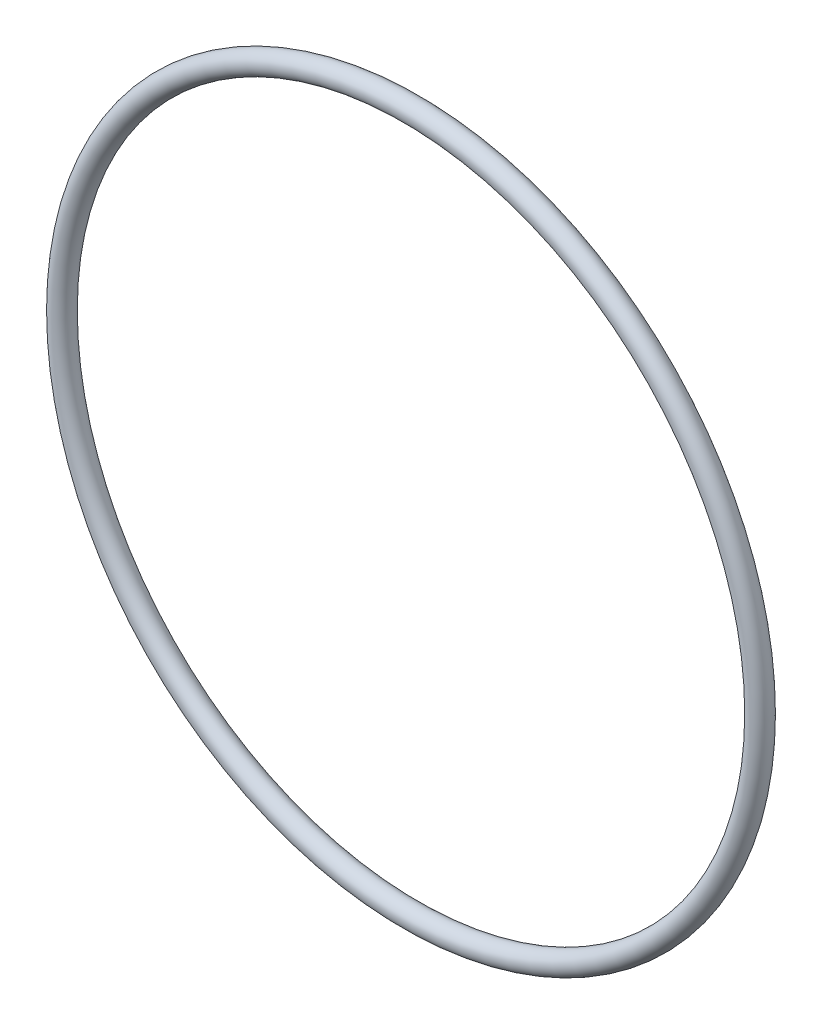
ISO-10303-21;
HEADER;
FILE_DESCRIPTION(('STEP AP214'),'2;1');
FILE_NAME('part.step','',(''),(''),'','','');
FILE_SCHEMA(('AUTOMOTIVE_DESIGN { 1 0 10303 214 1 1 1 1 }'));
ENDSEC;
DATA;
#1=APPLICATION_CONTEXT('core data for automotive mechanical design processes');
#2=APPLICATION_PROTOCOL_DEFINITION('international standard','automotive_design',2000,#1);
#3=PRODUCT_CONTEXT('',#1,'mechanical');
#4=PRODUCT('Part','Part','',(#3));
#5=PRODUCT_RELATED_PRODUCT_CATEGORY('part','',(#4));
#6=PRODUCT_DEFINITION_FORMATION('','',#4);
#7=PRODUCT_DEFINITION_CONTEXT('part definition',#1,'design');
#8=PRODUCT_DEFINITION('design','',#6,#7);
#9=PRODUCT_DEFINITION_SHAPE('','',#8);
#10=(LENGTH_UNIT() NAMED_UNIT(*) SI_UNIT(.MILLI.,.METRE.));
#11=(NAMED_UNIT(*) PLANE_ANGLE_UNIT() SI_UNIT($,.RADIAN.));
#12=(NAMED_UNIT(*) SI_UNIT($,.STERADIAN.) SOLID_ANGLE_UNIT());
#13=UNCERTAINTY_MEASURE_WITH_UNIT(LENGTH_MEASURE(1.E-05),#10,'distance_accuracy_value','');
#14=(GEOMETRIC_REPRESENTATION_CONTEXT(3) GLOBAL_UNCERTAINTY_ASSIGNED_CONTEXT((#13)) GLOBAL_UNIT_ASSIGNED_CONTEXT((#10,
#11,#12)) REPRESENTATION_CONTEXT('',''));
#15=CARTESIAN_POINT('',(0.,0.,0.));
#16=DIRECTION('',(0.,0.,1.));
#17=DIRECTION('',(1.,0.,0.));
#18=AXIS2_PLACEMENT_3D('',#15,#16,#17);
#19=CARTESIAN_POINT('',(0.,0.,0.));
#20=DIRECTION('',(0.,0.,-1.));
#21=DIRECTION('',(-1.,0.,0.));
#22=AXIS2_PLACEMENT_3D('',#19,#20,#21);
#23=TOROIDAL_SURFACE('',#22,28.9,0.9);
#24=CARTESIAN_POINT('',(-29.8,0.,0.));
#25=VERTEX_POINT('',#24);
#26=VERTEX_LOOP('',#25);
#27=FACE_BOUND('',#26,.T.);
#28=ADVANCED_FACE('F30',(#27),#23,.T.);
#29=CLOSED_SHELL('',(#28));
#30=MANIFOLD_SOLID_BREP('B2',#29);
#31=ADVANCED_BREP_SHAPE_REPRESENTATION('',(#18,#30),#14);
#32=SHAPE_DEFINITION_REPRESENTATION(#9,#31);
ENDSEC;
END-ISO-10303-21;
